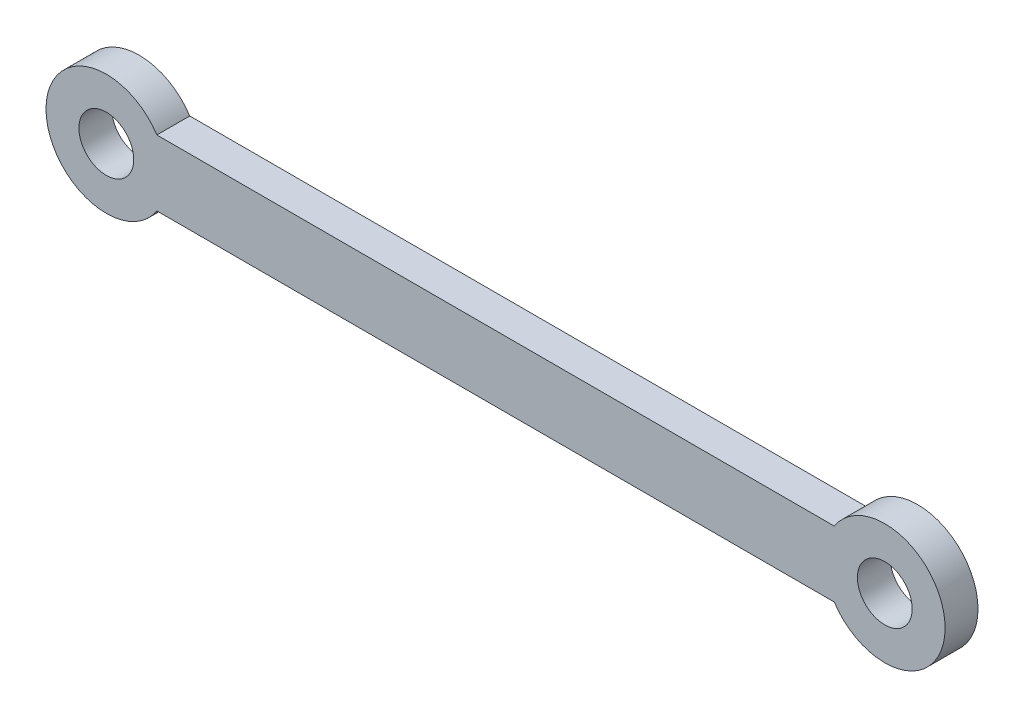
ISO-10303-21;
HEADER;
FILE_DESCRIPTION(('STEP AP214'),'2;1');
FILE_NAME('part.step','',(''),(''),'','','');
FILE_SCHEMA(('AUTOMOTIVE_DESIGN { 1 0 10303 214 1 1 1 1 }'));
ENDSEC;
DATA;
#1=APPLICATION_CONTEXT('core data for automotive mechanical design processes');
#2=APPLICATION_PROTOCOL_DEFINITION('international standard','automotive_design',2000,#1);
#3=PRODUCT_CONTEXT('',#1,'mechanical');
#4=PRODUCT('Part','Part','',(#3));
#5=PRODUCT_RELATED_PRODUCT_CATEGORY('part','',(#4));
#6=PRODUCT_DEFINITION_FORMATION('','',#4);
#7=PRODUCT_DEFINITION_CONTEXT('part definition',#1,'design');
#8=PRODUCT_DEFINITION('design','',#6,#7);
#9=PRODUCT_DEFINITION_SHAPE('','',#8);
#10=(LENGTH_UNIT() NAMED_UNIT(*) SI_UNIT(.MILLI.,.METRE.));
#11=(NAMED_UNIT(*) PLANE_ANGLE_UNIT() SI_UNIT($,.RADIAN.));
#12=(NAMED_UNIT(*) SI_UNIT($,.STERADIAN.) SOLID_ANGLE_UNIT());
#13=UNCERTAINTY_MEASURE_WITH_UNIT(LENGTH_MEASURE(1.E-05),#10,'distance_accuracy_value','');
#14=(GEOMETRIC_REPRESENTATION_CONTEXT(3) GLOBAL_UNCERTAINTY_ASSIGNED_CONTEXT((#13)) GLOBAL_UNIT_ASSIGNED_CONTEXT((#10,
#11,#12)) REPRESENTATION_CONTEXT('',''));
#15=CARTESIAN_POINT('',(0.,0.,0.));
#16=DIRECTION('',(0.,0.,1.));
#17=DIRECTION('',(1.,0.,0.));
#18=AXIS2_PLACEMENT_3D('',#15,#16,#17);
#19=CARTESIAN_POINT('',(0.,-3.,3.));
#20=DIRECTION('',(0.,1.,0.));
#21=DIRECTION('',(0.,0.,1.));
#22=AXIS2_PLACEMENT_3D('',#19,#20,#21);
#23=PLANE('',#22);
#24=DIRECTION('',(1.,0.,0.));
#25=VECTOR('',#24,1.);
#26=CARTESIAN_POINT('',(0.,-3.,0.));
#27=LINE('',#26,#25);
#28=CARTESIAN_POINT('',(4.60977222864644,-3.,0.));
#29=VERTEX_POINT('',#28);
#30=CARTESIAN_POINT('',(66.3902277713536,-3.,0.));
#31=VERTEX_POINT('',#30);
#32=EDGE_CURVE('E123',#29,#31,#27,.T.);
#33=ORIENTED_EDGE('',*,*,#32,.T.);
#34=DIRECTION('',(0.,0.,-1.));
#35=VECTOR('',#34,1.);
#36=CARTESIAN_POINT('',(66.3902277713536,-3.,3.));
#37=LINE('',#36,#35);
#38=CARTESIAN_POINT('',(66.3902277713536,-3.,3.));
#39=VERTEX_POINT('',#38);
#40=EDGE_CURVE('E11',#39,#31,#37,.T.);
#41=ORIENTED_EDGE('',*,*,#40,.F.);
#42=DIRECTION('',(1.,0.,0.));
#43=VECTOR('',#42,1.);
#44=CARTESIAN_POINT('',(0.,-3.,3.));
#45=LINE('',#44,#43);
#46=CARTESIAN_POINT('',(4.60977222864644,-3.,3.));
#47=VERTEX_POINT('',#46);
#48=EDGE_CURVE('E96',#47,#39,#45,.T.);
#49=ORIENTED_EDGE('',*,*,#48,.F.);
#50=DIRECTION('',(0.,0.,-1.));
#51=VECTOR('',#50,1.);
#52=CARTESIAN_POINT('',(4.60977222864644,-3.,3.));
#53=LINE('',#52,#51);
#54=EDGE_CURVE('E122',#47,#29,#53,.T.);
#55=ORIENTED_EDGE('',*,*,#54,.T.);
#56=EDGE_LOOP('',(#33,#41,#49,#55));
#57=FACE_BOUND('',#56,.T.);
#58=ADVANCED_FACE('F47',(#57),#23,.F.);
#59=CARTESIAN_POINT('',(71.,0.,3.));
#60=DIRECTION('',(0.,0.,-1.));
#61=DIRECTION('',(-1.,0.,0.));
#62=AXIS2_PLACEMENT_3D('',#59,#60,#61);
#63=CYLINDRICAL_SURFACE('',#62,5.5);
#64=CARTESIAN_POINT('',(71.,0.,0.));
#65=DIRECTION('',(0.,0.,1.));
#66=DIRECTION('',(1.,0.,0.));
#67=AXIS2_PLACEMENT_3D('',#64,#65,#66);
#68=CIRCLE('',#67,5.5);
#69=CARTESIAN_POINT('',(66.3902277713536,3.,0.));
#70=VERTEX_POINT('',#69);
#71=EDGE_CURVE('E102',#31,#70,#68,.T.);
#72=ORIENTED_EDGE('',*,*,#71,.T.);
#73=DIRECTION('',(0.,0.,-1.));
#74=VECTOR('',#73,1.);
#75=CARTESIAN_POINT('',(66.3902277713536,3.,3.));
#76=LINE('',#75,#74);
#77=CARTESIAN_POINT('',(66.3902277713536,3.,3.));
#78=VERTEX_POINT('',#77);
#79=EDGE_CURVE('E56',#78,#70,#76,.T.);
#80=ORIENTED_EDGE('',*,*,#79,.F.);
#81=CARTESIAN_POINT('',(71.,0.,3.));
#82=DIRECTION('',(0.,0.,1.));
#83=DIRECTION('',(1.,0.,0.));
#84=AXIS2_PLACEMENT_3D('',#81,#82,#83);
#85=CIRCLE('',#84,5.5);
#86=EDGE_CURVE('E90',#39,#78,#85,.T.);
#87=ORIENTED_EDGE('',*,*,#86,.F.);
#88=ORIENTED_EDGE('',*,*,#40,.T.);
#89=EDGE_LOOP('',(#72,#80,#87,#88));
#90=FACE_BOUND('',#89,.T.);
#91=ADVANCED_FACE('F101',(#90),#63,.T.);
#92=CARTESIAN_POINT('',(0.,3.,3.));
#93=DIRECTION('',(0.,1.,0.));
#94=DIRECTION('',(0.,0.,1.));
#95=AXIS2_PLACEMENT_3D('',#92,#93,#94);
#96=PLANE('',#95);
#97=DIRECTION('',(1.,0.,0.));
#98=VECTOR('',#97,1.);
#99=CARTESIAN_POINT('',(0.,3.,0.));
#100=LINE('',#99,#98);
#101=CARTESIAN_POINT('',(4.60977222864644,3.,0.));
#102=VERTEX_POINT('',#101);
#103=EDGE_CURVE('E129',#102,#70,#100,.T.);
#104=ORIENTED_EDGE('',*,*,#103,.F.);
#105=DIRECTION('',(0.,0.,-1.));
#106=VECTOR('',#105,1.);
#107=CARTESIAN_POINT('',(4.60977222864644,3.,3.));
#108=LINE('',#107,#106);
#109=CARTESIAN_POINT('',(4.60977222864644,3.,3.));
#110=VERTEX_POINT('',#109);
#111=EDGE_CURVE('E80',#110,#102,#108,.T.);
#112=ORIENTED_EDGE('',*,*,#111,.F.);
#113=DIRECTION('',(1.,0.,0.));
#114=VECTOR('',#113,1.);
#115=CARTESIAN_POINT('',(0.,3.,3.));
#116=LINE('',#115,#114);
#117=EDGE_CURVE('E94',#110,#78,#116,.T.);
#118=ORIENTED_EDGE('',*,*,#117,.T.);
#119=ORIENTED_EDGE('',*,*,#79,.T.);
#120=EDGE_LOOP('',(#104,#112,#118,#119));
#121=FACE_BOUND('',#120,.T.);
#122=ADVANCED_FACE('F107',(#121),#96,.T.);
#123=CARTESIAN_POINT('',(0.,0.,3.));
#124=DIRECTION('',(0.,0.,-1.));
#125=DIRECTION('',(-1.,0.,0.));
#126=AXIS2_PLACEMENT_3D('',#123,#124,#125);
#127=CYLINDRICAL_SURFACE('',#126,2.5);
#128=CARTESIAN_POINT('',(0.,0.,3.));
#129=DIRECTION('',(0.,0.,1.));
#130=DIRECTION('',(1.,0.,0.));
#131=AXIS2_PLACEMENT_3D('',#128,#129,#130);
#132=CIRCLE('',#131,2.5);
#133=CARTESIAN_POINT('',(2.5,0.,3.));
#134=VERTEX_POINT('',#133);
#135=EDGE_CURVE('E111',#134,#134,#132,.T.);
#136=ORIENTED_EDGE('',*,*,#135,.T.);
#137=EDGE_LOOP('',(#136));
#138=FACE_BOUND('',#137,.T.);
#139=CARTESIAN_POINT('',(0.,0.,0.));
#140=DIRECTION('',(0.,0.,1.));
#141=DIRECTION('',(1.,0.,0.));
#142=AXIS2_PLACEMENT_3D('',#139,#140,#141);
#143=CIRCLE('',#142,2.5);
#144=CARTESIAN_POINT('',(2.5,0.,0.));
#145=VERTEX_POINT('',#144);
#146=EDGE_CURVE('E134',#145,#145,#143,.T.);
#147=ORIENTED_EDGE('',*,*,#146,.F.);
#148=EDGE_LOOP('',(#147));
#149=FACE_BOUND('',#148,.T.);
#150=ADVANCED_FACE('F166',(#138,#149),#127,.F.);
#151=CARTESIAN_POINT('',(0.,0.,3.));
#152=DIRECTION('',(0.,0.,-1.));
#153=DIRECTION('',(-1.,0.,0.));
#154=AXIS2_PLACEMENT_3D('',#151,#152,#153);
#155=CYLINDRICAL_SURFACE('',#154,5.5);
#156=CARTESIAN_POINT('',(0.,0.,0.));
#157=DIRECTION('',(0.,0.,1.));
#158=DIRECTION('',(1.,0.,0.));
#159=AXIS2_PLACEMENT_3D('',#156,#157,#158);
#160=CIRCLE('',#159,5.5);
#161=EDGE_CURVE('E83',#102,#29,#160,.T.);
#162=ORIENTED_EDGE('',*,*,#161,.T.);
#163=ORIENTED_EDGE('',*,*,#54,.F.);
#164=CARTESIAN_POINT('',(0.,0.,3.));
#165=DIRECTION('',(0.,0.,1.));
#166=DIRECTION('',(1.,0.,0.));
#167=AXIS2_PLACEMENT_3D('',#164,#165,#166);
#168=CIRCLE('',#167,5.5);
#169=EDGE_CURVE('E64',#110,#47,#168,.T.);
#170=ORIENTED_EDGE('',*,*,#169,.F.);
#171=ORIENTED_EDGE('',*,*,#111,.T.);
#172=EDGE_LOOP('',(#162,#163,#170,#171));
#173=FACE_BOUND('',#172,.T.);
#174=ADVANCED_FACE('F158',(#173),#155,.T.);
#175=CARTESIAN_POINT('',(71.,0.,3.));
#176=DIRECTION('',(0.,0.,-1.));
#177=DIRECTION('',(-1.,0.,0.));
#178=AXIS2_PLACEMENT_3D('',#175,#176,#177);
#179=CYLINDRICAL_SURFACE('',#178,2.49999999999999);
#180=CARTESIAN_POINT('',(71.,0.,3.));
#181=DIRECTION('',(0.,0.,1.));
#182=DIRECTION('',(1.,0.,0.));
#183=AXIS2_PLACEMENT_3D('',#180,#181,#182);
#184=CIRCLE('',#183,2.49999999999999);
#185=CARTESIAN_POINT('',(73.5,0.,3.));
#186=VERTEX_POINT('',#185);
#187=EDGE_CURVE('E118',#186,#186,#184,.T.);
#188=ORIENTED_EDGE('',*,*,#187,.T.);
#189=EDGE_LOOP('',(#188));
#190=FACE_BOUND('',#189,.T.);
#191=CARTESIAN_POINT('',(71.,0.,0.));
#192=DIRECTION('',(0.,0.,1.));
#193=DIRECTION('',(1.,0.,0.));
#194=AXIS2_PLACEMENT_3D('',#191,#192,#193);
#195=CIRCLE('',#194,2.49999999999999);
#196=CARTESIAN_POINT('',(73.5,0.,0.));
#197=VERTEX_POINT('',#196);
#198=EDGE_CURVE('E138',#197,#197,#195,.T.);
#199=ORIENTED_EDGE('',*,*,#198,.F.);
#200=EDGE_LOOP('',(#199));
#201=FACE_BOUND('',#200,.T.);
#202=ADVANCED_FACE('F156',(#190,#201),#179,.F.);
#203=CARTESIAN_POINT('',(0.,0.,3.));
#204=DIRECTION('',(0.,0.,1.));
#205=DIRECTION('',(1.,0.,0.));
#206=AXIS2_PLACEMENT_3D('',#203,#204,#205);
#207=PLANE('',#206);
#208=ORIENTED_EDGE('',*,*,#48,.T.);
#209=ORIENTED_EDGE('',*,*,#86,.T.);
#210=ORIENTED_EDGE('',*,*,#117,.F.);
#211=ORIENTED_EDGE('',*,*,#169,.T.);
#212=EDGE_LOOP('',(#208,#209,#210,#211));
#213=FACE_BOUND('',#212,.T.);
#214=ORIENTED_EDGE('',*,*,#135,.F.);
#215=EDGE_LOOP('',(#214));
#216=FACE_BOUND('',#215,.T.);
#217=ORIENTED_EDGE('',*,*,#187,.F.);
#218=EDGE_LOOP('',(#217));
#219=FACE_BOUND('',#218,.T.);
#220=ADVANCED_FACE('F91',(#213,#216,#219),#207,.T.);
#221=CARTESIAN_POINT('',(0.,0.,0.));
#222=DIRECTION('',(0.,0.,1.));
#223=DIRECTION('',(1.,0.,0.));
#224=AXIS2_PLACEMENT_3D('',#221,#222,#223);
#225=PLANE('',#224);
#226=ORIENTED_EDGE('',*,*,#32,.F.);
#227=ORIENTED_EDGE('',*,*,#161,.F.);
#228=ORIENTED_EDGE('',*,*,#103,.T.);
#229=ORIENTED_EDGE('',*,*,#71,.F.);
#230=EDGE_LOOP('',(#226,#227,#228,#229));
#231=FACE_BOUND('',#230,.T.);
#232=ORIENTED_EDGE('',*,*,#146,.T.);
#233=EDGE_LOOP('',(#232));
#234=FACE_BOUND('',#233,.T.);
#235=ORIENTED_EDGE('',*,*,#198,.T.);
#236=EDGE_LOOP('',(#235));
#237=FACE_BOUND('',#236,.T.);
#238=ADVANCED_FACE('F148',(#231,#234,#237),#225,.F.);
#239=CLOSED_SHELL('',(#58,#91,#122,#150,#174,#202,#220,#238));
#240=MANIFOLD_SOLID_BREP('B2',#239);
#241=ADVANCED_BREP_SHAPE_REPRESENTATION('',(#18,#240),#14);
#242=SHAPE_DEFINITION_REPRESENTATION(#9,#241);
ENDSEC;
END-ISO-10303-21;
